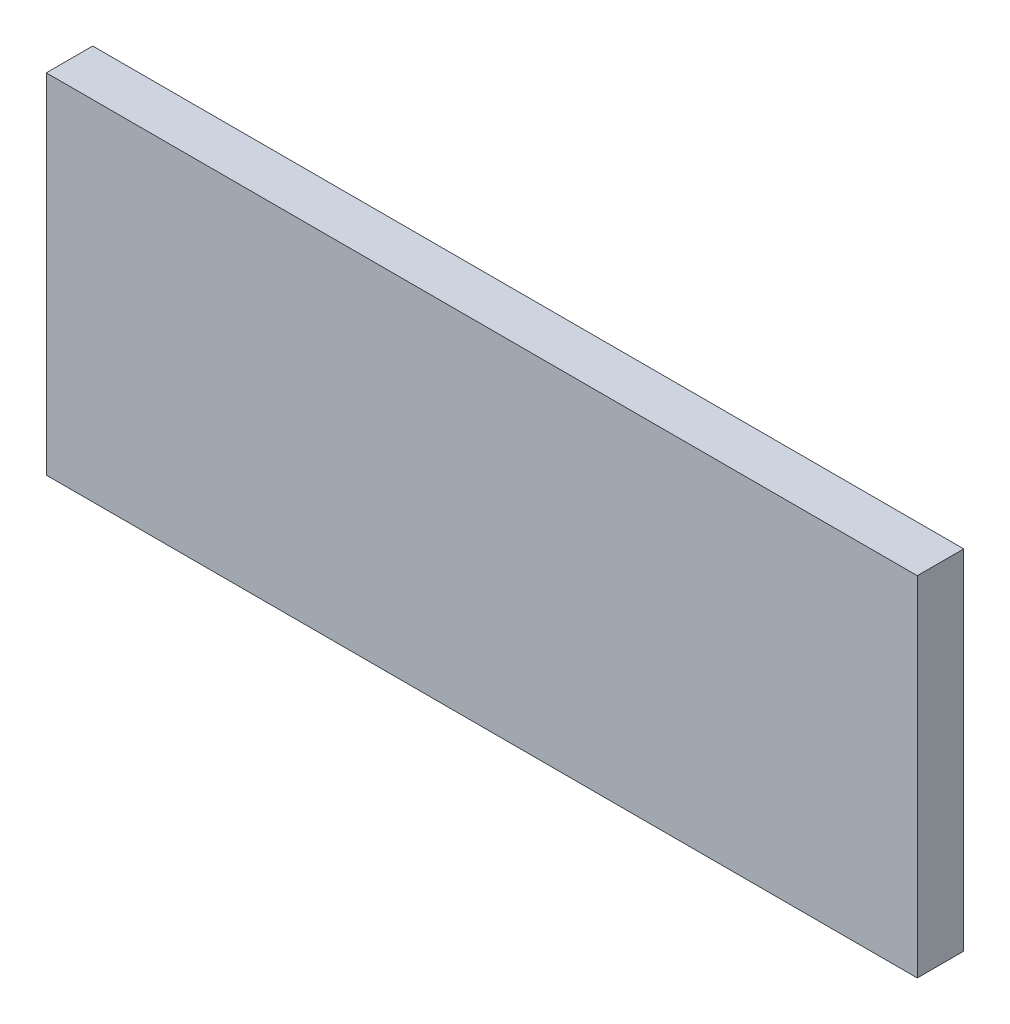
ISO-10303-21;
HEADER;
FILE_DESCRIPTION(('STEP AP214'),'2;1');
FILE_NAME('part.step','',(''),(''),'','','');
FILE_SCHEMA(('AUTOMOTIVE_DESIGN { 1 0 10303 214 1 1 1 1 }'));
ENDSEC;
DATA;
#1=APPLICATION_CONTEXT('core data for automotive mechanical design processes');
#2=APPLICATION_PROTOCOL_DEFINITION('international standard','automotive_design',2000,#1);
#3=PRODUCT_CONTEXT('',#1,'mechanical');
#4=PRODUCT('Part','Part','',(#3));
#5=PRODUCT_RELATED_PRODUCT_CATEGORY('part','',(#4));
#6=PRODUCT_DEFINITION_FORMATION('','',#4);
#7=PRODUCT_DEFINITION_CONTEXT('part definition',#1,'design');
#8=PRODUCT_DEFINITION('design','',#6,#7);
#9=PRODUCT_DEFINITION_SHAPE('','',#8);
#10=(LENGTH_UNIT() NAMED_UNIT(*) SI_UNIT(.MILLI.,.METRE.));
#11=(NAMED_UNIT(*) PLANE_ANGLE_UNIT() SI_UNIT($,.RADIAN.));
#12=(NAMED_UNIT(*) SI_UNIT($,.STERADIAN.) SOLID_ANGLE_UNIT());
#13=UNCERTAINTY_MEASURE_WITH_UNIT(LENGTH_MEASURE(1.E-05),#10,'distance_accuracy_value','');
#14=(GEOMETRIC_REPRESENTATION_CONTEXT(3) GLOBAL_UNCERTAINTY_ASSIGNED_CONTEXT((#13)) GLOBAL_UNIT_ASSIGNED_CONTEXT((#10,
#11,#12)) REPRESENTATION_CONTEXT('',''));
#15=CARTESIAN_POINT('',(0.,0.,0.));
#16=DIRECTION('',(0.,0.,1.));
#17=DIRECTION('',(1.,0.,0.));
#18=AXIS2_PLACEMENT_3D('',#15,#16,#17);
#19=CARTESIAN_POINT('',(0.,0.,8.));
#20=DIRECTION('',(1.,0.,0.));
#21=DIRECTION('',(0.,0.,-1.));
#22=AXIS2_PLACEMENT_3D('',#19,#20,#21);
#23=PLANE('',#22);
#24=DIRECTION('',(0.,-1.,0.));
#25=VECTOR('',#24,1.);
#26=CARTESIAN_POINT('',(0.,0.,0.));
#27=LINE('',#26,#25);
#28=CARTESIAN_POINT('',(0.,60.,0.));
#29=VERTEX_POINT('',#28);
#30=CARTESIAN_POINT('',(0.,0.,0.));
#31=VERTEX_POINT('',#30);
#32=EDGE_CURVE('E100',#29,#31,#27,.T.);
#33=ORIENTED_EDGE('',*,*,#32,.T.);
#34=DIRECTION('',(0.,0.,-1.));
#35=VECTOR('',#34,1.);
#36=CARTESIAN_POINT('',(0.,0.,8.));
#37=LINE('',#36,#35);
#38=CARTESIAN_POINT('',(0.,0.,8.));
#39=VERTEX_POINT('',#38);
#40=EDGE_CURVE('E11',#39,#31,#37,.T.);
#41=ORIENTED_EDGE('',*,*,#40,.F.);
#42=DIRECTION('',(0.,-1.,0.));
#43=VECTOR('',#42,1.);
#44=CARTESIAN_POINT('',(0.,0.,8.));
#45=LINE('',#44,#43);
#46=CARTESIAN_POINT('',(0.,60.,8.));
#47=VERTEX_POINT('',#46);
#48=EDGE_CURVE('E88',#47,#39,#45,.T.);
#49=ORIENTED_EDGE('',*,*,#48,.F.);
#50=DIRECTION('',(0.,0.,-1.));
#51=VECTOR('',#50,1.);
#52=CARTESIAN_POINT('',(0.,60.,8.));
#53=LINE('',#52,#51);
#54=EDGE_CURVE('E96',#47,#29,#53,.T.);
#55=ORIENTED_EDGE('',*,*,#54,.T.);
#56=EDGE_LOOP('',(#33,#41,#49,#55));
#57=FACE_BOUND('',#56,.T.);
#58=ADVANCED_FACE('F37',(#57),#23,.F.);
#59=CARTESIAN_POINT('',(0.,0.,8.));
#60=DIRECTION('',(0.,1.,0.));
#61=DIRECTION('',(0.,0.,1.));
#62=AXIS2_PLACEMENT_3D('',#59,#60,#61);
#63=PLANE('',#62);
#64=DIRECTION('',(1.,0.,0.));
#65=VECTOR('',#64,1.);
#66=CARTESIAN_POINT('',(0.,0.,0.));
#67=LINE('',#66,#65);
#68=CARTESIAN_POINT('',(150.,0.,0.));
#69=VERTEX_POINT('',#68);
#70=EDGE_CURVE('E92',#31,#69,#67,.T.);
#71=ORIENTED_EDGE('',*,*,#70,.T.);
#72=DIRECTION('',(0.,0.,-1.));
#73=VECTOR('',#72,1.);
#74=CARTESIAN_POINT('',(150.,0.,8.));
#75=LINE('',#74,#73);
#76=CARTESIAN_POINT('',(150.,0.,8.));
#77=VERTEX_POINT('',#76);
#78=EDGE_CURVE('E45',#77,#69,#75,.T.);
#79=ORIENTED_EDGE('',*,*,#78,.F.);
#80=DIRECTION('',(1.,0.,0.));
#81=VECTOR('',#80,1.);
#82=CARTESIAN_POINT('',(0.,0.,8.));
#83=LINE('',#82,#81);
#84=EDGE_CURVE('E83',#39,#77,#83,.T.);
#85=ORIENTED_EDGE('',*,*,#84,.F.);
#86=ORIENTED_EDGE('',*,*,#40,.T.);
#87=EDGE_LOOP('',(#71,#79,#85,#86));
#88=FACE_BOUND('',#87,.T.);
#89=ADVANCED_FACE('F91',(#88),#63,.F.);
#90=CARTESIAN_POINT('',(150.,0.,8.));
#91=DIRECTION('',(-1.,0.,0.));
#92=DIRECTION('',(0.,0.,1.));
#93=AXIS2_PLACEMENT_3D('',#90,#91,#92);
#94=PLANE('',#93);
#95=DIRECTION('',(0.,1.,0.));
#96=VECTOR('',#95,1.);
#97=CARTESIAN_POINT('',(150.,0.,0.));
#98=LINE('',#97,#96);
#99=CARTESIAN_POINT('',(150.,60.,0.));
#100=VERTEX_POINT('',#99);
#101=EDGE_CURVE('E70',#69,#100,#98,.T.);
#102=ORIENTED_EDGE('',*,*,#101,.T.);
#103=DIRECTION('',(0.,0.,-1.));
#104=VECTOR('',#103,1.);
#105=CARTESIAN_POINT('',(150.,60.,8.));
#106=LINE('',#105,#104);
#107=CARTESIAN_POINT('',(150.,60.,8.));
#108=VERTEX_POINT('',#107);
#109=EDGE_CURVE('E93',#108,#100,#106,.T.);
#110=ORIENTED_EDGE('',*,*,#109,.F.);
#111=DIRECTION('',(0.,1.,0.));
#112=VECTOR('',#111,1.);
#113=CARTESIAN_POINT('',(150.,0.,8.));
#114=LINE('',#113,#112);
#115=EDGE_CURVE('E86',#77,#108,#114,.T.);
#116=ORIENTED_EDGE('',*,*,#115,.F.);
#117=ORIENTED_EDGE('',*,*,#78,.T.);
#118=EDGE_LOOP('',(#102,#110,#116,#117));
#119=FACE_BOUND('',#118,.T.);
#120=ADVANCED_FACE('F94',(#119),#94,.F.);
#121=CARTESIAN_POINT('',(0.,60.,8.));
#122=DIRECTION('',(0.,-1.,0.));
#123=DIRECTION('',(0.,0.,-1.));
#124=AXIS2_PLACEMENT_3D('',#121,#122,#123);
#125=PLANE('',#124);
#126=DIRECTION('',(-1.,0.,0.));
#127=VECTOR('',#126,1.);
#128=CARTESIAN_POINT('',(0.,60.,0.));
#129=LINE('',#128,#127);
#130=EDGE_CURVE('E76',#100,#29,#129,.T.);
#131=ORIENTED_EDGE('',*,*,#130,.T.);
#132=ORIENTED_EDGE('',*,*,#54,.F.);
#133=DIRECTION('',(-1.,0.,0.));
#134=VECTOR('',#133,1.);
#135=CARTESIAN_POINT('',(0.,60.,8.));
#136=LINE('',#135,#134);
#137=EDGE_CURVE('E53',#108,#47,#136,.T.);
#138=ORIENTED_EDGE('',*,*,#137,.F.);
#139=ORIENTED_EDGE('',*,*,#109,.T.);
#140=EDGE_LOOP('',(#131,#132,#138,#139));
#141=FACE_BOUND('',#140,.T.);
#142=ADVANCED_FACE('F107',(#141),#125,.F.);
#143=CARTESIAN_POINT('',(0.,0.,8.));
#144=DIRECTION('',(0.,0.,-1.));
#145=DIRECTION('',(-1.,0.,0.));
#146=AXIS2_PLACEMENT_3D('',#143,#144,#145);
#147=PLANE('',#146);
#148=ORIENTED_EDGE('',*,*,#48,.T.);
#149=ORIENTED_EDGE('',*,*,#84,.T.);
#150=ORIENTED_EDGE('',*,*,#115,.T.);
#151=ORIENTED_EDGE('',*,*,#137,.T.);
#152=EDGE_LOOP('',(#148,#149,#150,#151));
#153=FACE_BOUND('',#152,.T.);
#154=ADVANCED_FACE('F84',(#153),#147,.F.);
#155=CARTESIAN_POINT('',(0.,0.,0.));
#156=DIRECTION('',(0.,0.,-1.));
#157=DIRECTION('',(-1.,0.,0.));
#158=AXIS2_PLACEMENT_3D('',#155,#156,#157);
#159=PLANE('',#158);
#160=ORIENTED_EDGE('',*,*,#32,.F.);
#161=ORIENTED_EDGE('',*,*,#130,.F.);
#162=ORIENTED_EDGE('',*,*,#101,.F.);
#163=ORIENTED_EDGE('',*,*,#70,.F.);
#164=EDGE_LOOP('',(#160,#161,#162,#163));
#165=FACE_BOUND('',#164,.T.);
#166=ADVANCED_FACE('F110',(#165),#159,.T.);
#167=CLOSED_SHELL('',(#58,#89,#120,#142,#154,#166));
#168=MANIFOLD_SOLID_BREP('B2',#167);
#169=ADVANCED_BREP_SHAPE_REPRESENTATION('',(#18,#168),#14);
#170=SHAPE_DEFINITION_REPRESENTATION(#9,#169);
ENDSEC;
END-ISO-10303-21;
